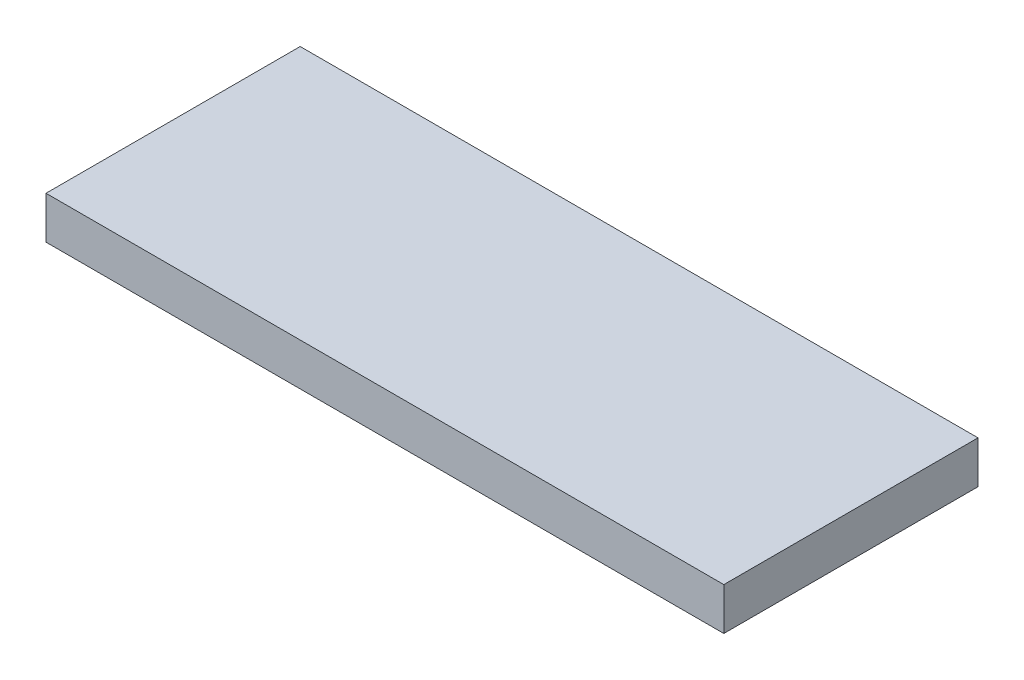
ISO-10303-21;
HEADER;
FILE_DESCRIPTION(('STEP AP214'),'2;1');
FILE_NAME('part.step','',(''),(''),'','','');
FILE_SCHEMA(('AUTOMOTIVE_DESIGN { 1 0 10303 214 1 1 1 1 }'));
ENDSEC;
DATA;
#1=APPLICATION_CONTEXT('core data for automotive mechanical design processes');
#2=APPLICATION_PROTOCOL_DEFINITION('international standard','automotive_design',2000,#1);
#3=PRODUCT_CONTEXT('',#1,'mechanical');
#4=PRODUCT('Part','Part','',(#3));
#5=PRODUCT_RELATED_PRODUCT_CATEGORY('part','',(#4));
#6=PRODUCT_DEFINITION_FORMATION('','',#4);
#7=PRODUCT_DEFINITION_CONTEXT('part definition',#1,'design');
#8=PRODUCT_DEFINITION('design','',#6,#7);
#9=PRODUCT_DEFINITION_SHAPE('','',#8);
#10=(LENGTH_UNIT() NAMED_UNIT(*) SI_UNIT(.MILLI.,.METRE.));
#11=(NAMED_UNIT(*) PLANE_ANGLE_UNIT() SI_UNIT($,.RADIAN.));
#12=(NAMED_UNIT(*) SI_UNIT($,.STERADIAN.) SOLID_ANGLE_UNIT());
#13=UNCERTAINTY_MEASURE_WITH_UNIT(LENGTH_MEASURE(1.E-05),#10,'distance_accuracy_value','');
#14=(GEOMETRIC_REPRESENTATION_CONTEXT(3) GLOBAL_UNCERTAINTY_ASSIGNED_CONTEXT((#13)) GLOBAL_UNIT_ASSIGNED_CONTEXT((#10,
#11,#12)) REPRESENTATION_CONTEXT('',''));
#15=CARTESIAN_POINT('',(0.,0.,0.));
#16=DIRECTION('',(0.,0.,1.));
#17=DIRECTION('',(1.,0.,0.));
#18=AXIS2_PLACEMENT_3D('',#15,#16,#17);
#19=CARTESIAN_POINT('',(80.,10.,-30.));
#20=DIRECTION('',(-1.,0.,0.));
#21=DIRECTION('',(0.,0.,1.));
#22=AXIS2_PLACEMENT_3D('',#19,#20,#21);
#23=PLANE('',#22);
#24=DIRECTION('',(0.,0.,-1.));
#25=VECTOR('',#24,1.);
#26=CARTESIAN_POINT('',(80.,0.,-30.));
#27=LINE('',#26,#25);
#28=CARTESIAN_POINT('',(80.,0.,30.));
#29=VERTEX_POINT('',#28);
#30=CARTESIAN_POINT('',(80.,0.,-30.));
#31=VERTEX_POINT('',#30);
#32=EDGE_CURVE('E95',#29,#31,#27,.T.);
#33=ORIENTED_EDGE('',*,*,#32,.T.);
#34=DIRECTION('',(0.,-1.,0.));
#35=VECTOR('',#34,1.);
#36=CARTESIAN_POINT('',(80.,10.,-30.));
#37=LINE('',#36,#35);
#38=CARTESIAN_POINT('',(80.,10.,-30.));
#39=VERTEX_POINT('',#38);
#40=EDGE_CURVE('E11',#39,#31,#37,.T.);
#41=ORIENTED_EDGE('',*,*,#40,.F.);
#42=DIRECTION('',(0.,0.,-1.));
#43=VECTOR('',#42,1.);
#44=CARTESIAN_POINT('',(80.,10.,-30.));
#45=LINE('',#44,#43);
#46=CARTESIAN_POINT('',(80.,10.,30.));
#47=VERTEX_POINT('',#46);
#48=EDGE_CURVE('E83',#47,#39,#45,.T.);
#49=ORIENTED_EDGE('',*,*,#48,.F.);
#50=DIRECTION('',(0.,-1.,0.));
#51=VECTOR('',#50,1.);
#52=CARTESIAN_POINT('',(80.,10.,30.));
#53=LINE('',#52,#51);
#54=EDGE_CURVE('E91',#47,#29,#53,.T.);
#55=ORIENTED_EDGE('',*,*,#54,.T.);
#56=EDGE_LOOP('',(#33,#41,#49,#55));
#57=FACE_BOUND('',#56,.T.);
#58=ADVANCED_FACE('F32',(#57),#23,.F.);
#59=CARTESIAN_POINT('',(-80.,10.,-30.));
#60=DIRECTION('',(0.,0.,1.));
#61=DIRECTION('',(1.,0.,0.));
#62=AXIS2_PLACEMENT_3D('',#59,#60,#61);
#63=PLANE('',#62);
#64=DIRECTION('',(-1.,0.,0.));
#65=VECTOR('',#64,1.);
#66=CARTESIAN_POINT('',(-80.,0.,-30.));
#67=LINE('',#66,#65);
#68=CARTESIAN_POINT('',(-80.,0.,-30.));
#69=VERTEX_POINT('',#68);
#70=EDGE_CURVE('E87',#31,#69,#67,.T.);
#71=ORIENTED_EDGE('',*,*,#70,.T.);
#72=DIRECTION('',(0.,-1.,0.));
#73=VECTOR('',#72,1.);
#74=CARTESIAN_POINT('',(-80.,10.,-30.));
#75=LINE('',#74,#73);
#76=CARTESIAN_POINT('',(-80.,10.,-30.));
#77=VERTEX_POINT('',#76);
#78=EDGE_CURVE('E40',#77,#69,#75,.T.);
#79=ORIENTED_EDGE('',*,*,#78,.F.);
#80=DIRECTION('',(-1.,0.,0.));
#81=VECTOR('',#80,1.);
#82=CARTESIAN_POINT('',(-80.,10.,-30.));
#83=LINE('',#82,#81);
#84=EDGE_CURVE('E78',#39,#77,#83,.T.);
#85=ORIENTED_EDGE('',*,*,#84,.F.);
#86=ORIENTED_EDGE('',*,*,#40,.T.);
#87=EDGE_LOOP('',(#71,#79,#85,#86));
#88=FACE_BOUND('',#87,.T.);
#89=ADVANCED_FACE('F86',(#88),#63,.F.);
#90=CARTESIAN_POINT('',(-80.,10.,-30.));
#91=DIRECTION('',(1.,0.,0.));
#92=DIRECTION('',(0.,0.,-1.));
#93=AXIS2_PLACEMENT_3D('',#90,#91,#92);
#94=PLANE('',#93);
#95=DIRECTION('',(0.,0.,1.));
#96=VECTOR('',#95,1.);
#97=CARTESIAN_POINT('',(-80.,0.,-30.));
#98=LINE('',#97,#96);
#99=CARTESIAN_POINT('',(-80.,0.,30.));
#100=VERTEX_POINT('',#99);
#101=EDGE_CURVE('E65',#69,#100,#98,.T.);
#102=ORIENTED_EDGE('',*,*,#101,.T.);
#103=DIRECTION('',(0.,-1.,0.));
#104=VECTOR('',#103,1.);
#105=CARTESIAN_POINT('',(-80.,10.,30.));
#106=LINE('',#105,#104);
#107=CARTESIAN_POINT('',(-80.,10.,30.));
#108=VERTEX_POINT('',#107);
#109=EDGE_CURVE('E88',#108,#100,#106,.T.);
#110=ORIENTED_EDGE('',*,*,#109,.F.);
#111=DIRECTION('',(0.,0.,1.));
#112=VECTOR('',#111,1.);
#113=CARTESIAN_POINT('',(-80.,10.,-30.));
#114=LINE('',#113,#112);
#115=EDGE_CURVE('E81',#77,#108,#114,.T.);
#116=ORIENTED_EDGE('',*,*,#115,.F.);
#117=ORIENTED_EDGE('',*,*,#78,.T.);
#118=EDGE_LOOP('',(#102,#110,#116,#117));
#119=FACE_BOUND('',#118,.T.);
#120=ADVANCED_FACE('F89',(#119),#94,.F.);
#121=CARTESIAN_POINT('',(-80.,10.,30.));
#122=DIRECTION('',(0.,0.,-1.));
#123=DIRECTION('',(-1.,0.,0.));
#124=AXIS2_PLACEMENT_3D('',#121,#122,#123);
#125=PLANE('',#124);
#126=DIRECTION('',(1.,0.,0.));
#127=VECTOR('',#126,1.);
#128=CARTESIAN_POINT('',(-80.,0.,30.));
#129=LINE('',#128,#127);
#130=EDGE_CURVE('E71',#100,#29,#129,.T.);
#131=ORIENTED_EDGE('',*,*,#130,.T.);
#132=ORIENTED_EDGE('',*,*,#54,.F.);
#133=DIRECTION('',(1.,0.,0.));
#134=VECTOR('',#133,1.);
#135=CARTESIAN_POINT('',(-80.,10.,30.));
#136=LINE('',#135,#134);
#137=EDGE_CURVE('E48',#108,#47,#136,.T.);
#138=ORIENTED_EDGE('',*,*,#137,.F.);
#139=ORIENTED_EDGE('',*,*,#109,.T.);
#140=EDGE_LOOP('',(#131,#132,#138,#139));
#141=FACE_BOUND('',#140,.T.);
#142=ADVANCED_FACE('F102',(#141),#125,.F.);
#143=CARTESIAN_POINT('',(0.,10.,0.));
#144=DIRECTION('',(0.,1.,0.));
#145=DIRECTION('',(0.,0.,1.));
#146=AXIS2_PLACEMENT_3D('',#143,#144,#145);
#147=PLANE('',#146);
#148=ORIENTED_EDGE('',*,*,#48,.T.);
#149=ORIENTED_EDGE('',*,*,#84,.T.);
#150=ORIENTED_EDGE('',*,*,#115,.T.);
#151=ORIENTED_EDGE('',*,*,#137,.T.);
#152=EDGE_LOOP('',(#148,#149,#150,#151));
#153=FACE_BOUND('',#152,.T.);
#154=ADVANCED_FACE('F79',(#153),#147,.T.);
#155=CARTESIAN_POINT('',(0.,0.,0.));
#156=DIRECTION('',(0.,1.,0.));
#157=DIRECTION('',(0.,0.,1.));
#158=AXIS2_PLACEMENT_3D('',#155,#156,#157);
#159=PLANE('',#158);
#160=ORIENTED_EDGE('',*,*,#32,.F.);
#161=ORIENTED_EDGE('',*,*,#130,.F.);
#162=ORIENTED_EDGE('',*,*,#101,.F.);
#163=ORIENTED_EDGE('',*,*,#70,.F.);
#164=EDGE_LOOP('',(#160,#161,#162,#163));
#165=FACE_BOUND('',#164,.T.);
#166=ADVANCED_FACE('F105',(#165),#159,.F.);
#167=CLOSED_SHELL('',(#58,#89,#120,#142,#154,#166));
#168=MANIFOLD_SOLID_BREP('B2',#167);
#169=ADVANCED_BREP_SHAPE_REPRESENTATION('',(#18,#168),#14);
#170=SHAPE_DEFINITION_REPRESENTATION(#9,#169);
ENDSEC;
END-ISO-10303-21;
